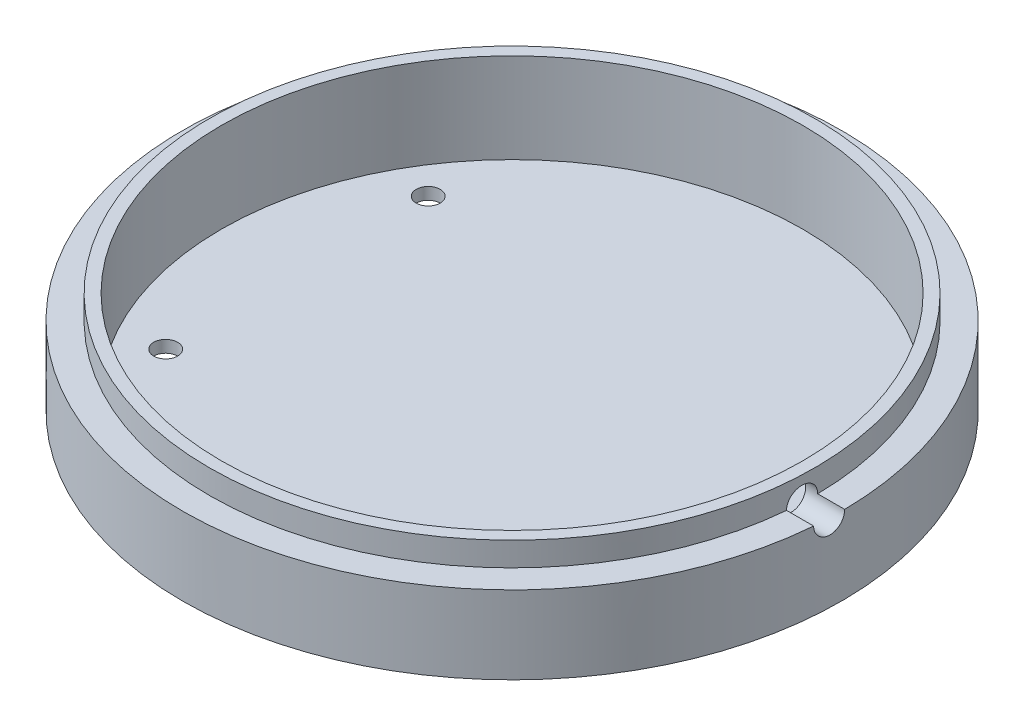
ISO-10303-21;
HEADER;
FILE_DESCRIPTION(('STEP AP214'),'2;1');
FILE_NAME('part.step','',(''),(''),'','','');
FILE_SCHEMA(('AUTOMOTIVE_DESIGN { 1 0 10303 214 1 1 1 1 }'));
ENDSEC;
DATA;
#1=APPLICATION_CONTEXT('core data for automotive mechanical design processes');
#2=APPLICATION_PROTOCOL_DEFINITION('international standard','automotive_design',2000,#1);
#3=PRODUCT_CONTEXT('',#1,'mechanical');
#4=PRODUCT('Part','Part','',(#3));
#5=PRODUCT_RELATED_PRODUCT_CATEGORY('part','',(#4));
#6=PRODUCT_DEFINITION_FORMATION('','',#4);
#7=PRODUCT_DEFINITION_CONTEXT('part definition',#1,'design');
#8=PRODUCT_DEFINITION('design','',#6,#7);
#9=PRODUCT_DEFINITION_SHAPE('','',#8);
#10=(LENGTH_UNIT() NAMED_UNIT(*) SI_UNIT(.MILLI.,.METRE.));
#11=(NAMED_UNIT(*) PLANE_ANGLE_UNIT() SI_UNIT($,.RADIAN.));
#12=(NAMED_UNIT(*) SI_UNIT($,.STERADIAN.) SOLID_ANGLE_UNIT());
#13=UNCERTAINTY_MEASURE_WITH_UNIT(LENGTH_MEASURE(1.E-05),#10,'distance_accuracy_value','');
#14=(GEOMETRIC_REPRESENTATION_CONTEXT(3) GLOBAL_UNCERTAINTY_ASSIGNED_CONTEXT((#13)) GLOBAL_UNIT_ASSIGNED_CONTEXT((#10,
#11,#12)) REPRESENTATION_CONTEXT('',''));
#15=CARTESIAN_POINT('',(0.,0.,0.));
#16=DIRECTION('',(0.,0.,1.));
#17=DIRECTION('',(1.,0.,0.));
#18=AXIS2_PLACEMENT_3D('',#15,#16,#17);
#19=CARTESIAN_POINT('',(0.,13.,0.));
#20=DIRECTION('',(0.,-1.,0.));
#21=DIRECTION('',(0.,0.,-1.));
#22=AXIS2_PLACEMENT_3D('',#19,#20,#21);
#23=CYLINDRICAL_SURFACE('',#22,55.);
#24=CARTESIAN_POINT('',(0.,0.,0.));
#25=DIRECTION('',(0.,1.,0.));
#26=DIRECTION('',(0.,0.,1.));
#27=AXIS2_PLACEMENT_3D('',#24,#25,#26);
#28=CIRCLE('',#27,55.);
#29=CARTESIAN_POINT('',(0.,0.,55.));
#30=VERTEX_POINT('',#29);
#31=EDGE_CURVE('E192',#30,#30,#28,.T.);
#32=ORIENTED_EDGE('',*,*,#31,.T.);
#33=EDGE_LOOP('',(#32));
#34=FACE_BOUND('',#33,.T.);
#35=CARTESIAN_POINT('',(54.8155999693518,13.,4.5));
#36=CARTESIAN_POINT('',(54.8155983995871,12.9298297064675,4.50000686898044));
#37=CARTESIAN_POINT('',(54.8158424708288,12.8596627290745,4.49704571114808));
#38=CARTESIAN_POINT('',(54.8168102127968,12.7198326668636,4.48524049891385));
#39=CARTESIAN_POINT('',(54.817533855794,12.6501695531472,4.4763967846463));
#40=CARTESIAN_POINT('',(54.8194482712985,12.511893308751,4.45288930525375));
#41=CARTESIAN_POINT('',(54.8206386579611,12.4432793593086,4.43823034732211));
#42=CARTESIAN_POINT('',(54.8234623014956,12.3075513393883,4.40321324488677));
#43=CARTESIAN_POINT('',(54.8250955538865,12.2404372537414,4.38285515805018));
#44=CARTESIAN_POINT('',(54.8306186752923,12.0420000555667,4.31340330285218));
#45=CARTESIAN_POINT('',(54.8351328519614,11.9135165507092,4.25592074868602));
#46=CARTESIAN_POINT('',(54.8454876976989,11.6681199865616,4.12032400604888));
#47=CARTESIAN_POINT('',(54.8513281602884,11.5512051303029,4.04221302874706));
#48=CARTESIAN_POINT('',(54.8639319033103,11.331895926801,3.86738298659584));
#49=CARTESIAN_POINT('',(54.8706969246008,11.2295297333087,3.77062867374373));
#50=CARTESIAN_POINT('',(54.8846778692196,11.0424664608524,3.56133585574425));
#51=CARTESIAN_POINT('',(54.8918938646935,10.9577722184538,3.4487948214746));
#52=CARTESIAN_POINT('',(54.9063282778711,10.8082614167667,3.21081585107867));
#53=CARTESIAN_POINT('',(54.9135466584752,10.7434938934282,3.08534709817857));
#54=CARTESIAN_POINT('',(54.927539858995,10.6359607438593,2.82529691658091));
#55=CARTESIAN_POINT('',(54.9343147061477,10.5931937654913,2.69071604848275));
#56=CARTESIAN_POINT('',(54.9470719937661,10.5308776725196,2.41622598188404));
#57=CARTESIAN_POINT('',(54.9530543300848,10.5113316067874,2.27631608617846));
#58=CARTESIAN_POINT('',(54.9639803254768,10.4960436611623,1.99515819421601));
#59=CARTESIAN_POINT('',(54.9689239704275,10.5003021049075,1.85391017979258));
#60=CARTESIAN_POINT('',(54.9776408652268,10.5324955513434,1.57433731308931));
#61=CARTESIAN_POINT('',(54.981416024597,10.5603916438506,1.43600803954293));
#62=CARTESIAN_POINT('',(54.9878054829992,10.6390301187327,1.16597601403474));
#63=CARTESIAN_POINT('',(54.9904197940988,10.6897722636034,1.03427319320114));
#64=CARTESIAN_POINT('',(54.9945942782886,10.8125918179653,0.781402844326326));
#65=CARTESIAN_POINT('',(54.9961557220252,10.8846433586514,0.660222771480109));
#66=CARTESIAN_POINT('',(54.9984249148587,11.0480584929222,0.431670323347613));
#67=CARTESIAN_POINT('',(54.9991327047969,11.1394211623602,0.324297287711839));
#68=CARTESIAN_POINT('',(54.9999439314467,11.338855132503,0.126412340330451));
#69=CARTESIAN_POINT('',(55.0000474330046,11.4469246391163,0.0358986204176465));
#70=CARTESIAN_POINT('',(54.9999158777237,11.6767601403725,-0.125741007440721));
#71=CARTESIAN_POINT('',(54.9996807141877,11.7985304403338,-0.196860796893223));
#72=CARTESIAN_POINT('',(54.9991156728593,12.0523860507389,-0.317720039174873));
#73=CARTESIAN_POINT('',(54.9987856957761,12.1844820683789,-0.367436941367662));
#74=CARTESIAN_POINT('',(54.9982220247451,12.4550443456375,-0.443915443368607));
#75=CARTESIAN_POINT('',(54.9979881857985,12.5935006591629,-0.470711679356618));
#76=CARTESIAN_POINT('',(54.997813076319,12.7774087930417,-0.490473167770539));
#77=CARTESIAN_POINT('',(54.9977810379513,12.8218913510113,-0.494047607667849));
#78=CARTESIAN_POINT('',(54.9977381353444,12.9109098931291,-0.498807772845912));
#79=CARTESIAN_POINT('',(54.997727235937,12.9554456649861,-0.499997465672938));
#80=CARTESIAN_POINT('',(54.9977272257682,13.,-0.500000000000002));
#81=B_SPLINE_CURVE_WITH_KNOTS('',3,(#35,#36,#37,#38,#39,#40,#41,#42,#43,#44,#45,#46,#47,#48,#49,
#50,#51,#52,#53,#54,#55,#56,#57,#58,#59,#60,#61,#62,#63,#64,#65,#66,#67,#68,#69,#70,#71,#72,#73,
#74,#75,#76,#77,#78,#79,#80),.UNSPECIFIED.,.F.,.F.,(4,2,2,2,2,2,2,2,2,2,2,2,2,2,2,2,2,2,2,2,2,2,
4),(0.,0.210442048238931,0.420871929600584,0.631128219576992,0.841382382134809,1.26169399365941,
1.68194021497366,2.10298891175693,2.52410514013121,2.94624951819372,3.36836794846858,
3.79054179614422,4.21272138356788,4.63420736376111,5.05568896235081,5.47666098376657,
5.89761286384909,6.31851957067453,6.73955891400426,7.16104079595895,7.58188463173058,
7.71571748361011,7.84932748996267),.UNSPECIFIED.);
#82=CARTESIAN_POINT('',(54.8155999693518,13.,4.5));
#83=VERTEX_POINT('',#82);
#84=CARTESIAN_POINT('',(54.9977272257682,13.,-0.500000000000002));
#85=VERTEX_POINT('',#84);
#86=EDGE_CURVE('E152',#83,#85,#81,.T.);
#87=ORIENTED_EDGE('',*,*,#86,.F.);
#88=CARTESIAN_POINT('',(0.,13.,0.));
#89=DIRECTION('',(0.,1.,0.));
#90=DIRECTION('',(0.,0.,1.));
#91=AXIS2_PLACEMENT_3D('',#88,#89,#90);
#92=CIRCLE('',#91,55.);
#93=EDGE_CURVE('E197',#85,#83,#92,.T.);
#94=ORIENTED_EDGE('',*,*,#93,.F.);
#95=EDGE_LOOP('',(#87,#94));
#96=FACE_BOUND('',#95,.T.);
#97=ADVANCED_FACE('F37',(#34,#96),#23,.T.);
#98=CARTESIAN_POINT('',(0.,13.,0.));
#99=DIRECTION('',(0.,1.,0.));
#100=DIRECTION('',(0.,0.,1.));
#101=AXIS2_PLACEMENT_3D('',#98,#99,#100);
#102=PLANE('',#101);
#103=CARTESIAN_POINT('',(0.,13.,0.));
#104=DIRECTION('',(0.,1.,0.));
#105=DIRECTION('',(0.,0.,1.));
#106=AXIS2_PLACEMENT_3D('',#103,#104,#105);
#107=CIRCLE('',#106,50.5);
#108=CARTESIAN_POINT('',(50.4975246918104,13.,-0.500000000000002));
#109=VERTEX_POINT('',#108);
#110=CARTESIAN_POINT('',(50.2991053598372,13.,4.5));
#111=VERTEX_POINT('',#110);
#112=EDGE_CURVE('E193',#109,#111,#107,.T.);
#113=ORIENTED_EDGE('',*,*,#112,.F.);
#114=DIRECTION('',(-1.,0.,0.));
#115=VECTOR('',#114,1.);
#116=CARTESIAN_POINT('',(56.,13.,-0.500000000000002));
#117=LINE('',#116,#115);
#118=EDGE_CURVE('E159',#109,#85,#117,.F.);
#119=ORIENTED_EDGE('',*,*,#118,.T.);
#120=ORIENTED_EDGE('',*,*,#93,.T.);
#121=DIRECTION('',(-1.,0.,0.));
#122=VECTOR('',#121,1.);
#123=CARTESIAN_POINT('',(56.,13.,4.5));
#124=LINE('',#123,#122);
#125=EDGE_CURVE('E126',#83,#111,#124,.T.);
#126=ORIENTED_EDGE('',*,*,#125,.T.);
#127=EDGE_LOOP('',(#113,#119,#120,#126));
#128=FACE_BOUND('',#127,.T.);
#129=ADVANCED_FACE('F227',(#128),#102,.T.);
#130=CARTESIAN_POINT('',(0.,17.,0.));
#131=DIRECTION('',(0.,-1.,0.));
#132=DIRECTION('',(0.,0.,-1.));
#133=AXIS2_PLACEMENT_3D('',#130,#131,#132);
#134=CYLINDRICAL_SURFACE('',#133,50.5);
#135=CARTESIAN_POINT('',(0.,17.,0.));
#136=DIRECTION('',(0.,1.,0.));
#137=DIRECTION('',(0.,0.,1.));
#138=AXIS2_PLACEMENT_3D('',#135,#136,#137);
#139=CIRCLE('',#138,50.5);
#140=CARTESIAN_POINT('',(0.,17.,50.5));
#141=VERTEX_POINT('',#140);
#142=EDGE_CURVE('E187',#141,#141,#139,.T.);
#143=ORIENTED_EDGE('',*,*,#142,.F.);
#144=EDGE_LOOP('',(#143));
#145=FACE_BOUND('',#144,.T.);
#146=CARTESIAN_POINT('',(50.4975246918104,13.,-0.500000000000002));
#147=CARTESIAN_POINT('',(50.4975235310463,13.0703141617699,-0.500006737916495));
#148=CARTESIAN_POINT('',(50.4975540352248,13.1406251209342,-0.497033575310143));
#149=CARTESIAN_POINT('',(50.4976698978328,13.2807439427119,-0.485179598875231));
#150=CARTESIAN_POINT('',(50.4977552536124,13.3505518294646,-0.476299070440282));
#151=CARTESIAN_POINT('',(50.4979722690332,13.4891259949242,-0.452690801115224));
#152=CARTESIAN_POINT('',(50.498103896092,13.5578929711504,-0.437967173767282));
#153=CARTESIAN_POINT('',(50.4983966558226,13.6939253088943,-0.402792166829666));
#154=CARTESIAN_POINT('',(50.4985577881394,13.761190688474,-0.382340856175736));
#155=CARTESIAN_POINT('',(50.4990544981741,13.9600831154657,-0.312561401881597));
#156=CARTESIAN_POINT('',(50.4994035129552,14.0888653097096,-0.254797654838552));
#157=CARTESIAN_POINT('',(50.4999065962343,14.3348074035332,-0.118508939536619));
#158=CARTESIAN_POINT('',(50.5000607027914,14.4519695680081,-0.0399880280991187));
#159=CARTESIAN_POINT('',(50.4998940270044,14.6714698436737,0.13561532029478));
#160=CARTESIAN_POINT('',(50.4995732426742,14.7738078928668,0.232697834875917));
#161=CARTESIAN_POINT('',(50.4981686666377,14.9607413301456,0.44267555411543));
#162=CARTESIAN_POINT('',(50.4970847619767,15.0453340892258,0.555573097680334));
#163=CARTESIAN_POINT('',(50.4938995690931,15.1943262001763,0.79390230590476));
#164=CARTESIAN_POINT('',(50.4917987573651,15.2587349864386,0.919328078356843));
#165=CARTESIAN_POINT('',(50.4863982636354,15.3655833016323,1.17917767483354));
#166=CARTESIAN_POINT('',(50.4830986637118,15.4080243341598,1.3136008823119));
#167=CARTESIAN_POINT('',(50.4752253125479,15.4697400062555,1.58757472676412));
#168=CARTESIAN_POINT('',(50.4706520362157,15.4890232663151,1.72712343581916));
#169=CARTESIAN_POINT('',(50.4602801151441,15.5039258991904,2.00743611753879));
#170=CARTESIAN_POINT('',(50.4544814370701,15.4995446281806,2.14820012316314));
#171=CARTESIAN_POINT('',(50.441835865312,15.4672508165578,2.42707635379939));
#172=CARTESIAN_POINT('',(50.434988074918,15.4393180528718,2.56518619547225));
#173=CARTESIAN_POINT('',(50.420556551376,15.3607057623341,2.83473214981485));
#174=CARTESIAN_POINT('',(50.4129728102832,15.3100259899043,2.96616819041677));
#175=CARTESIAN_POINT('',(50.3974659028099,15.1872335658996,3.21893056513912));
#176=CARTESIAN_POINT('',(50.3895420688211,15.1150769380903,3.34023549564468));
#177=CARTESIAN_POINT('',(50.3738560602053,14.9514108055068,3.56900451357347));
#178=CARTESIAN_POINT('',(50.3660938792407,14.8599020610108,3.6764691444678));
#179=CARTESIAN_POINT('',(50.3512397799751,14.6600243436771,3.87460366824136));
#180=CARTESIAN_POINT('',(50.3441484117502,14.5516417234245,3.96525983542569));
#181=CARTESIAN_POINT('',(50.33113958478,14.3210818704748,4.12710612463342));
#182=CARTESIAN_POINT('',(50.3252224857801,14.1989004283475,4.1982902837944));
#183=CARTESIAN_POINT('',(50.3150055301361,13.9444485190086,4.3190159141041));
#184=CARTESIAN_POINT('',(50.3107034297673,13.8121923584533,4.36858742737552));
#185=CARTESIAN_POINT('',(50.3040336815916,13.5412899184967,4.44473636019518));
#186=CARTESIAN_POINT('',(50.3016630293529,13.4026539194659,4.47134949607089));
#187=CARTESIAN_POINT('',(50.2999313614506,13.2192399442779,4.49075841006472));
#188=CARTESIAN_POINT('',(50.2996216318764,13.1754258928969,4.4942257820374));
#189=CARTESIAN_POINT('',(50.2992089106256,13.0877471877113,4.4988434098493));
#190=CARTESIAN_POINT('',(50.2991055792735,13.0438827361166,4.49999747277676));
#191=CARTESIAN_POINT('',(50.2991053598372,13.,4.5));
#192=B_SPLINE_CURVE_WITH_KNOTS('',3,(#146,#147,#148,#149,#150,#151,#152,#153,#154,#155,#156,
#157,#158,#159,#160,#161,#162,#163,#164,#165,#166,#167,#168,#169,#170,#171,#172,#173,#174,#175,
#176,#177,#178,#179,#180,#181,#182,#183,#184,#185,#186,#187,#188,#189,#190,#191),.UNSPECIFIED.,
.F.,.F.,(4,2,2,2,2,2,2,2,2,2,2,2,2,2,2,2,2,2,2,2,2,2,4),(0.,0.210873867449235,0.421737548008736,
0.632453043112771,0.843166002251652,1.26441502990909,1.68558178861128,2.10675030867397,
2.52798118182069,2.94901486854717,3.37001973355857,3.79086783069123,4.21172737762311,
4.63294867450751,5.0541745190324,5.47626887408816,5.89834664958425,6.3207675877957,
6.74331773842852,7.16527864640096,7.5865819202111,7.71839538623767,7.84999174384732),.UNSPECIFIED.);
#193=EDGE_CURVE('E118',#109,#111,#192,.T.);
#194=ORIENTED_EDGE('',*,*,#193,.F.);
#195=ORIENTED_EDGE('',*,*,#112,.T.);
#196=EDGE_LOOP('',(#194,#195));
#197=FACE_BOUND('',#196,.T.);
#198=ADVANCED_FACE('F128',(#145,#197),#134,.T.);
#199=CARTESIAN_POINT('',(0.,2.,0.));
#200=DIRECTION('',(0.,1.,0.));
#201=DIRECTION('',(0.,0.,1.));
#202=AXIS2_PLACEMENT_3D('',#199,#200,#201);
#203=CYLINDRICAL_SURFACE('',#202,48.5);
#204=CARTESIAN_POINT('',(0.,2.,0.));
#205=DIRECTION('',(0.,1.,0.));
#206=DIRECTION('',(0.,0.,1.));
#207=AXIS2_PLACEMENT_3D('',#204,#205,#206);
#208=CIRCLE('',#207,48.5);
#209=CARTESIAN_POINT('',(0.,2.,48.5));
#210=VERTEX_POINT('',#209);
#211=EDGE_CURVE('E184',#210,#210,#208,.T.);
#212=ORIENTED_EDGE('',*,*,#211,.F.);
#213=EDGE_LOOP('',(#212));
#214=FACE_BOUND('',#213,.T.);
#215=CARTESIAN_POINT('',(0.,17.,0.));
#216=DIRECTION('',(0.,1.,0.));
#217=DIRECTION('',(0.,0.,1.));
#218=AXIS2_PLACEMENT_3D('',#215,#216,#217);
#219=CIRCLE('',#218,48.5);
#220=CARTESIAN_POINT('',(0.,17.,48.5));
#221=VERTEX_POINT('',#220);
#222=EDGE_CURVE('E183',#221,#221,#219,.T.);
#223=ORIENTED_EDGE('',*,*,#222,.T.);
#224=EDGE_LOOP('',(#223));
#225=FACE_BOUND('',#224,.T.);
#226=CARTESIAN_POINT('',(48.2907858705985,13.,4.5));
#227=CARTESIAN_POINT('',(48.2907869983494,13.1400458171869,4.49999376397492));
#228=CARTESIAN_POINT('',(48.2918907021441,13.2801910099482,4.48819215089214));
#229=CARTESIAN_POINT('',(48.2962265607347,13.5566077401989,4.4412873276228));
#230=CARTESIAN_POINT('',(48.299461222655,13.6928745173943,4.40615666985574));
#231=CARTESIAN_POINT('',(48.30781305381,13.9574830838289,4.31362296534251));
#232=CARTESIAN_POINT('',(48.3129291088612,14.0858295111654,4.25623309966852));
#233=CARTESIAN_POINT('',(48.3246649170977,14.3310271215299,4.12084400911396));
#234=CARTESIAN_POINT('',(48.3312843306607,14.4478808923225,4.04284943837562));
#235=CARTESIAN_POINT('',(48.3455727644471,14.6671466057018,3.86823785388425));
#236=CARTESIAN_POINT('',(48.3532444122863,14.769521048206,3.77157396480461));
#237=CARTESIAN_POINT('',(48.3690986986214,14.9566145053684,3.56247969951368));
#238=CARTESIAN_POINT('',(48.3772813654191,15.0413325410319,3.45004844962752));
#239=CARTESIAN_POINT('',(48.3936565181206,15.1909744777779,3.21220200678276));
#240=CARTESIAN_POINT('',(48.4018489525332,15.2558345914832,3.08674667068886));
#241=CARTESIAN_POINT('',(48.4177319582093,15.3635543242681,2.82669160765621));
#242=CARTESIAN_POINT('',(48.4254225292327,15.4064139328293,2.69209187634552));
#243=CARTESIAN_POINT('',(48.4399051936473,15.4689043706511,2.417534835683));
#244=CARTESIAN_POINT('',(48.4466971541605,15.4885317679564,2.27757673792359));
#245=CARTESIAN_POINT('',(48.4591022764614,15.5039616585219,1.99630167778583));
#246=CARTESIAN_POINT('',(48.4647154547101,15.4997644845005,1.85498473441174));
#247=CARTESIAN_POINT('',(48.4746109420872,15.4676743516801,1.5753210531184));
#248=CARTESIAN_POINT('',(48.4788960209758,15.4398311669001,1.43696870154054));
#249=CARTESIAN_POINT('',(48.4861492064929,15.3612883557515,1.16687538695754));
#250=CARTESIAN_POINT('',(48.4891173235441,15.3105889102779,1.03513437163639));
#251=CARTESIAN_POINT('',(48.4938564158521,15.1878654257406,0.782227629154967));
#252=CARTESIAN_POINT('',(48.495629286958,15.115875419098,0.661045421218322));
#253=CARTESIAN_POINT('',(48.498206741385,14.9525810694077,0.432468418288963));
#254=CARTESIAN_POINT('',(48.499011324808,14.8612767283949,0.32507362184364));
#255=CARTESIAN_POINT('',(48.4999346579205,14.6619410320731,0.12711908176177));
#256=CARTESIAN_POINT('',(48.5000533864411,14.5539091605753,0.0365598578379977));
#257=CARTESIAN_POINT('',(48.499906157839,14.3241840867754,-0.125151211783195));
#258=CARTESIAN_POINT('',(48.4996401995591,14.2024908433771,-0.196302999096772));
#259=CARTESIAN_POINT('',(48.4990004965028,13.948819025278,-0.317217340452529));
#260=CARTESIAN_POINT('',(48.4986266894845,13.8168345434546,-0.36696750170044));
#261=CARTESIAN_POINT('',(48.4979864937392,13.5463870187929,-0.443606993328551));
#262=CARTESIAN_POINT('',(48.4977201050525,13.4079239735362,-0.470496315174723));
#263=CARTESIAN_POINT('',(48.4974182723465,13.1284282204978,-0.500653081529819));
#264=CARTESIAN_POINT('',(48.4973828618745,12.9873951424285,-0.503917094716511));
#265=CARTESIAN_POINT('',(48.4975584254694,12.7067828935153,-0.486721434199493));
#266=CARTESIAN_POINT('',(48.4977693996442,12.567203723308,-0.466261750110578));
#267=CARTESIAN_POINT('',(48.4983427516081,12.2934673149327,-0.402200996684137));
#268=CARTESIAN_POINT('',(48.4987051232031,12.1593098551962,-0.358600874056131));
#269=CARTESIAN_POINT('',(48.4993887585098,11.900218142056,-0.249497259290456));
#270=CARTESIAN_POINT('',(48.4997100221737,11.7752838993615,-0.183993741721003));
#271=CARTESIAN_POINT('',(48.5000474021985,11.5381788853034,-0.0329385307565904));
#272=CARTESIAN_POINT('',(48.5000635036592,11.4260087374432,0.0526141413801727));
#273=CARTESIAN_POINT('',(48.4994910988645,11.2176245498922,0.241336413439971));
#274=CARTESIAN_POINT('',(48.4989025938076,11.1214104785715,0.344505978440134));
#275=CARTESIAN_POINT('',(48.4968287410508,10.9476978141345,0.565495577012816));
#276=CARTESIAN_POINT('',(48.4953436597369,10.8701936715919,0.683311250755987));
#277=CARTESIAN_POINT('',(48.4912346809443,10.7360639585669,0.93026297259272));
#278=CARTESIAN_POINT('',(48.4886107914092,10.679438242453,1.05939894171694));
#279=CARTESIAN_POINT('',(48.4820730240634,10.5886917872186,1.32523528226841));
#280=CARTESIAN_POINT('',(48.4781598905006,10.5545580980456,1.46193125170266));
#281=CARTESIAN_POINT('',(48.4690092607255,10.5096950340537,1.73906758683945));
#282=CARTESIAN_POINT('',(48.4637717613087,10.498965715867,1.87950796160161));
#283=CARTESIAN_POINT('',(48.4520717499067,10.5011919939973,2.16020446790712));
#284=CARTESIAN_POINT('',(48.4456087518019,10.5141570068547,2.3004605040222));
#285=CARTESIAN_POINT('',(48.4316983596991,10.5633976107184,2.57676891696635));
#286=CARTESIAN_POINT('',(48.4242509511942,10.5996735452789,2.71282123181034));
#287=CARTESIAN_POINT('',(48.4087193758759,10.694588252759,2.97715748209569));
#288=CARTESIAN_POINT('',(48.4006339657292,10.753271591844,3.1054253419594));
#289=CARTESIAN_POINT('',(48.3843021994849,10.8913281673662,3.35028000325933));
#290=CARTESIAN_POINT('',(48.3760558472265,10.9707009108185,3.46686708293237));
#291=CARTESIAN_POINT('',(48.3599101143469,11.148048116964,3.68525774724829));
#292=CARTESIAN_POINT('',(48.3520113195286,11.2460526076055,3.78703699279143));
#293=CARTESIAN_POINT('',(48.3371102229767,11.4578507391222,3.9727165698393));
#294=CARTESIAN_POINT('',(48.3301081358122,11.5716481454915,4.05661262533356));
#295=CARTESIAN_POINT('',(48.3175076680898,11.81170309031,4.20403864436552));
#296=CARTESIAN_POINT('',(48.3119083742691,11.9379524471318,4.26758186578422));
#297=CARTESIAN_POINT('',(48.3025281377223,12.1992990127922,4.37247933629053));
#298=CARTESIAN_POINT('',(48.2987450062006,12.334385347175,4.41386030179198));
#299=CARTESIAN_POINT('',(48.29428496795,12.5586043713275,4.46232763393178));
#300=CARTESIAN_POINT('',(48.2929767974885,12.646269120631,4.4764364071059));
#301=CARTESIAN_POINT('',(48.2912268928844,12.8226092891764,4.4952745515513));
#302=CARTESIAN_POINT('',(48.2907851561984,12.9112847054506,4.50000395035577));
#303=CARTESIAN_POINT('',(48.2907858705985,13.,4.5));
#304=B_SPLINE_CURVE_WITH_KNOTS('',3,(#226,#227,#228,#229,#230,#231,#232,#233,#234,#235,#236,
#237,#238,#239,#240,#241,#242,#243,#244,#245,#246,#247,#248,#249,#250,#251,#252,#253,#254,#255,
#256,#257,#258,#259,#260,#261,#262,#263,#264,#265,#266,#267,#268,#269,#270,#271,#272,#273,#274,
#275,#276,#277,#278,#279,#280,#281,#282,#283,#284,#285,#286,#287,#288,#289,#290,#291,#292,#293,
#294,#295,#296,#297,#298,#299,#300,#301,#302,#303),.UNSPECIFIED.,.T.,.F.,(4,2,2,2,2,2,2,2,2,2,2,
2,2,2,2,2,2,2,2,2,2,2,2,2,2,2,2,2,2,2,2,2,2,2,2,2,2,2,4),(0.,0.419812985383906,
0.840120775190917,1.26018005347148,1.68014453075716,2.10117750384078,2.5222338157302,
2.94462878283616,3.36702395189101,3.78948151106725,4.21193317048901,4.6334977818766,
5.05505905686491,5.47595008584213,5.89684107047528,6.31774504582275,6.73865028737149,
7.15979893068439,7.5809477312134,8.00215769785337,8.42336784888087,8.84456076890713,
9.26575417797741,9.68696815277783,10.1081812925938,10.5292693452863,10.9503544607408,
11.3711969190864,11.7920403957547,12.213051159333,12.6340681278752,13.0559268573373,
13.4777755357113,13.9003099423644,14.3229452672459,14.7453047239898,15.1671538773262,
15.4330950009672,15.6990353439358),.UNSPECIFIED.);
#305=CARTESIAN_POINT('',(48.2907858705985,13.,4.5));
#306=VERTEX_POINT('',#305);
#307=EDGE_CURVE('E114',#306,#306,#304,.T.);
#308=ORIENTED_EDGE('',*,*,#307,.F.);
#309=EDGE_LOOP('',(#308));
#310=FACE_BOUND('',#309,.T.);
#311=ADVANCED_FACE('F208',(#214,#225,#310),#203,.F.);
#312=CARTESIAN_POINT('',(0.,0.,0.));
#313=DIRECTION('',(0.,1.,0.));
#314=DIRECTION('',(0.,0.,1.));
#315=AXIS2_PLACEMENT_3D('',#312,#313,#314);
#316=PLANE('',#315);
#317=ORIENTED_EDGE('',*,*,#31,.F.);
#318=EDGE_LOOP('',(#317));
#319=FACE_BOUND('',#318,.T.);
#320=CARTESIAN_POINT('',(36.,0.,22.));
#321=DIRECTION('',(0.,1.,0.));
#322=DIRECTION('',(0.,0.,1.));
#323=AXIS2_PLACEMENT_3D('',#320,#321,#322);
#324=CIRCLE('',#323,2.);
#325=CARTESIAN_POINT('',(36.,0.,24.));
#326=VERTEX_POINT('',#325);
#327=EDGE_CURVE('E171',#326,#326,#324,.T.);
#328=ORIENTED_EDGE('',*,*,#327,.T.);
#329=EDGE_LOOP('',(#328));
#330=FACE_BOUND('',#329,.T.);
#331=CARTESIAN_POINT('',(-36.,0.,-22.));
#332=DIRECTION('',(0.,1.,0.));
#333=DIRECTION('',(0.,0.,1.));
#334=AXIS2_PLACEMENT_3D('',#331,#332,#333);
#335=CIRCLE('',#334,2.);
#336=CARTESIAN_POINT('',(-36.,0.,-20.));
#337=VERTEX_POINT('',#336);
#338=EDGE_CURVE('E174',#337,#337,#335,.T.);
#339=ORIENTED_EDGE('',*,*,#338,.T.);
#340=EDGE_LOOP('',(#339));
#341=FACE_BOUND('',#340,.T.);
#342=CARTESIAN_POINT('',(-35.8,0.,22.));
#343=DIRECTION('',(0.,1.,0.));
#344=DIRECTION('',(0.,0.,1.));
#345=AXIS2_PLACEMENT_3D('',#342,#343,#344);
#346=CIRCLE('',#345,2.);
#347=CARTESIAN_POINT('',(-35.8,0.,24.));
#348=VERTEX_POINT('',#347);
#349=EDGE_CURVE('E177',#348,#348,#346,.T.);
#350=ORIENTED_EDGE('',*,*,#349,.T.);
#351=EDGE_LOOP('',(#350));
#352=FACE_BOUND('',#351,.T.);
#353=CARTESIAN_POINT('',(36.,0.,-22.));
#354=DIRECTION('',(0.,1.,0.));
#355=DIRECTION('',(0.,0.,1.));
#356=AXIS2_PLACEMENT_3D('',#353,#354,#355);
#357=CIRCLE('',#356,2.);
#358=CARTESIAN_POINT('',(36.,0.,-20.));
#359=VERTEX_POINT('',#358);
#360=EDGE_CURVE('E180',#359,#359,#357,.T.);
#361=ORIENTED_EDGE('',*,*,#360,.T.);
#362=EDGE_LOOP('',(#361));
#363=FACE_BOUND('',#362,.T.);
#364=ADVANCED_FACE('F204',(#319,#330,#341,#352,#363),#316,.F.);
#365=CARTESIAN_POINT('',(0.,2.,0.));
#366=DIRECTION('',(0.,1.,0.));
#367=DIRECTION('',(0.,0.,1.));
#368=AXIS2_PLACEMENT_3D('',#365,#366,#367);
#369=PLANE('',#368);
#370=DIRECTION('',(0.,0.,-1.));
#371=VECTOR('',#370,1.);
#372=CARTESIAN_POINT('',(40.3308376566258,2.,0.));
#373=LINE('',#372,#371);
#374=CARTESIAN_POINT('',(40.3308376566258,2.,4.07797949128508));
#375=VERTEX_POINT('',#374);
#376=CARTESIAN_POINT('',(40.3308376566258,2.,-3.30155452738268));
#377=VERTEX_POINT('',#376);
#378=EDGE_CURVE('E11',#375,#377,#373,.T.);
#379=ORIENTED_EDGE('',*,*,#378,.F.);
#380=DIRECTION('',(1.,0.,0.));
#381=VECTOR('',#380,1.);
#382=CARTESIAN_POINT('',(0.,2.,4.07797949128508));
#383=LINE('',#382,#381);
#384=CARTESIAN_POINT('',(34.05656444491,2.,4.07797949128508));
#385=VERTEX_POINT('',#384);
#386=EDGE_CURVE('E45',#385,#375,#383,.T.);
#387=ORIENTED_EDGE('',*,*,#386,.F.);
#388=DIRECTION('',(0.,0.,1.));
#389=VECTOR('',#388,1.);
#390=CARTESIAN_POINT('',(34.05656444491,2.,0.));
#391=LINE('',#390,#389);
#392=CARTESIAN_POINT('',(34.05656444491,2.,-3.30155452738268));
#393=VERTEX_POINT('',#392);
#394=EDGE_CURVE('E376',#393,#385,#391,.T.);
#395=ORIENTED_EDGE('',*,*,#394,.F.);
#396=DIRECTION('',(-1.,0.,0.));
#397=VECTOR('',#396,1.);
#398=CARTESIAN_POINT('',(0.,2.,-3.30155452738268));
#399=LINE('',#398,#397);
#400=EDGE_CURVE('E196',#377,#393,#399,.T.);
#401=ORIENTED_EDGE('',*,*,#400,.F.);
#402=EDGE_LOOP('',(#379,#387,#395,#401));
#403=FACE_BOUND('',#402,.T.);
#404=CARTESIAN_POINT('',(36.,2.,-22.));
#405=DIRECTION('',(0.,1.,0.));
#406=DIRECTION('',(0.,0.,1.));
#407=AXIS2_PLACEMENT_3D('',#404,#405,#406);
#408=CIRCLE('',#407,2.);
#409=CARTESIAN_POINT('',(36.,2.,-20.));
#410=VERTEX_POINT('',#409);
#411=EDGE_CURVE('E158',#410,#410,#408,.T.);
#412=ORIENTED_EDGE('',*,*,#411,.F.);
#413=EDGE_LOOP('',(#412));
#414=FACE_BOUND('',#413,.T.);
#415=CARTESIAN_POINT('',(-35.8,2.,22.));
#416=DIRECTION('',(0.,1.,0.));
#417=DIRECTION('',(0.,0.,1.));
#418=AXIS2_PLACEMENT_3D('',#415,#416,#417);
#419=CIRCLE('',#418,2.);
#420=CARTESIAN_POINT('',(-35.8,2.,24.));
#421=VERTEX_POINT('',#420);
#422=EDGE_CURVE('E164',#421,#421,#419,.T.);
#423=ORIENTED_EDGE('',*,*,#422,.F.);
#424=EDGE_LOOP('',(#423));
#425=FACE_BOUND('',#424,.T.);
#426=CARTESIAN_POINT('',(-36.,2.,-22.));
#427=DIRECTION('',(0.,1.,0.));
#428=DIRECTION('',(0.,0.,1.));
#429=AXIS2_PLACEMENT_3D('',#426,#427,#428);
#430=CIRCLE('',#429,2.);
#431=CARTESIAN_POINT('',(-36.,2.,-20.));
#432=VERTEX_POINT('',#431);
#433=EDGE_CURVE('E160',#432,#432,#430,.T.);
#434=ORIENTED_EDGE('',*,*,#433,.F.);
#435=EDGE_LOOP('',(#434));
#436=FACE_BOUND('',#435,.T.);
#437=CARTESIAN_POINT('',(36.,2.,22.));
#438=DIRECTION('',(0.,1.,0.));
#439=DIRECTION('',(0.,0.,1.));
#440=AXIS2_PLACEMENT_3D('',#437,#438,#439);
#441=CIRCLE('',#440,2.);
#442=CARTESIAN_POINT('',(36.,2.,24.));
#443=VERTEX_POINT('',#442);
#444=EDGE_CURVE('E163',#443,#443,#441,.T.);
#445=ORIENTED_EDGE('',*,*,#444,.F.);
#446=EDGE_LOOP('',(#445));
#447=FACE_BOUND('',#446,.T.);
#448=ORIENTED_EDGE('',*,*,#211,.T.);
#449=EDGE_LOOP('',(#448));
#450=FACE_BOUND('',#449,.T.);
#451=ADVANCED_FACE('F207',(#403,#414,#425,#436,#447,#450),#369,.T.);
#452=CARTESIAN_POINT('',(0.,17.,0.));
#453=DIRECTION('',(0.,1.,0.));
#454=DIRECTION('',(0.,0.,1.));
#455=AXIS2_PLACEMENT_3D('',#452,#453,#454);
#456=PLANE('',#455);
#457=ORIENTED_EDGE('',*,*,#222,.F.);
#458=EDGE_LOOP('',(#457));
#459=FACE_BOUND('',#458,.T.);
#460=ORIENTED_EDGE('',*,*,#142,.T.);
#461=EDGE_LOOP('',(#460));
#462=FACE_BOUND('',#461,.T.);
#463=ADVANCED_FACE('F250',(#459,#462),#456,.T.);
#464=CARTESIAN_POINT('',(36.,-13.,22.));
#465=DIRECTION('',(0.,1.,0.));
#466=DIRECTION('',(0.,0.,1.));
#467=AXIS2_PLACEMENT_3D('',#464,#465,#466);
#468=CYLINDRICAL_SURFACE('',#467,2.);
#469=ORIENTED_EDGE('',*,*,#444,.T.);
#470=EDGE_LOOP('',(#469));
#471=FACE_BOUND('',#470,.T.);
#472=ORIENTED_EDGE('',*,*,#327,.F.);
#473=EDGE_LOOP('',(#472));
#474=FACE_BOUND('',#473,.T.);
#475=ADVANCED_FACE('F252',(#471,#474),#468,.F.);
#476=CARTESIAN_POINT('',(-36.,-13.,-22.));
#477=DIRECTION('',(0.,1.,0.));
#478=DIRECTION('',(0.,0.,1.));
#479=AXIS2_PLACEMENT_3D('',#476,#477,#478);
#480=CYLINDRICAL_SURFACE('',#479,2.);
#481=ORIENTED_EDGE('',*,*,#433,.T.);
#482=EDGE_LOOP('',(#481));
#483=FACE_BOUND('',#482,.T.);
#484=ORIENTED_EDGE('',*,*,#338,.F.);
#485=EDGE_LOOP('',(#484));
#486=FACE_BOUND('',#485,.T.);
#487=ADVANCED_FACE('F140',(#483,#486),#480,.F.);
#488=CARTESIAN_POINT('',(-35.8,-13.,22.));
#489=DIRECTION('',(0.,1.,0.));
#490=DIRECTION('',(0.,0.,1.));
#491=AXIS2_PLACEMENT_3D('',#488,#489,#490);
#492=CYLINDRICAL_SURFACE('',#491,2.);
#493=ORIENTED_EDGE('',*,*,#422,.T.);
#494=EDGE_LOOP('',(#493));
#495=FACE_BOUND('',#494,.T.);
#496=ORIENTED_EDGE('',*,*,#349,.F.);
#497=EDGE_LOOP('',(#496));
#498=FACE_BOUND('',#497,.T.);
#499=ADVANCED_FACE('F218',(#495,#498),#492,.F.);
#500=CARTESIAN_POINT('',(36.,-13.,-22.));
#501=DIRECTION('',(0.,1.,0.));
#502=DIRECTION('',(0.,0.,1.));
#503=AXIS2_PLACEMENT_3D('',#500,#501,#502);
#504=CYLINDRICAL_SURFACE('',#503,2.);
#505=ORIENTED_EDGE('',*,*,#411,.T.);
#506=EDGE_LOOP('',(#505));
#507=FACE_BOUND('',#506,.T.);
#508=ORIENTED_EDGE('',*,*,#360,.F.);
#509=EDGE_LOOP('',(#508));
#510=FACE_BOUND('',#509,.T.);
#511=ADVANCED_FACE('F137',(#507,#510),#504,.F.);
#512=CARTESIAN_POINT('',(56.,13.,2.));
#513=DIRECTION('',(-1.,0.,0.));
#514=DIRECTION('',(0.,0.,1.));
#515=AXIS2_PLACEMENT_3D('',#512,#513,#514);
#516=CYLINDRICAL_SURFACE('',#515,2.5);
#517=ORIENTED_EDGE('',*,*,#307,.T.);
#518=EDGE_LOOP('',(#517));
#519=FACE_BOUND('',#518,.T.);
#520=ORIENTED_EDGE('',*,*,#86,.T.);
#521=ORIENTED_EDGE('',*,*,#118,.F.);
#522=ORIENTED_EDGE('',*,*,#193,.T.);
#523=ORIENTED_EDGE('',*,*,#125,.F.);
#524=EDGE_LOOP('',(#520,#521,#522,#523));
#525=FACE_BOUND('',#524,.T.);
#526=ADVANCED_FACE('F132',(#519,#525),#516,.F.);
#527=CARTESIAN_POINT('',(40.3308376566258,0.,4.07797949128508));
#528=DIRECTION('',(1.,0.,0.));
#529=DIRECTION('',(0.,0.,-1.));
#530=AXIS2_PLACEMENT_3D('',#527,#528,#529);
#531=PLANE('',#530);
#532=DIRECTION('',(0.,1.,0.));
#533=VECTOR('',#532,1.);
#534=CARTESIAN_POINT('',(40.3308376566258,0.,4.07797949128508));
#535=LINE('',#534,#533);
#536=CARTESIAN_POINT('',(40.3308376566258,2.01,4.07797949128508));
#537=VERTEX_POINT('',#536);
#538=EDGE_CURVE('E112',#375,#537,#535,.T.);
#539=ORIENTED_EDGE('',*,*,#538,.F.);
#540=ORIENTED_EDGE('',*,*,#378,.T.);
#541=DIRECTION('',(0.,1.,0.));
#542=VECTOR('',#541,1.);
#543=CARTESIAN_POINT('',(40.3308376566258,0.,-3.30155452738268));
#544=LINE('',#543,#542);
#545=CARTESIAN_POINT('',(40.3308376566258,2.01,-3.30155452738268));
#546=VERTEX_POINT('',#545);
#547=EDGE_CURVE('E85',#377,#546,#544,.T.);
#548=ORIENTED_EDGE('',*,*,#547,.T.);
#549=DIRECTION('',(0.,0.,-1.));
#550=VECTOR('',#549,1.);
#551=CARTESIAN_POINT('',(40.3308376566258,2.01,4.07797949128508));
#552=LINE('',#551,#550);
#553=EDGE_CURVE('E90',#537,#546,#552,.T.);
#554=ORIENTED_EDGE('',*,*,#553,.F.);
#555=EDGE_LOOP('',(#539,#540,#548,#554));
#556=FACE_BOUND('',#555,.T.);
#557=ADVANCED_FACE('F88',(#556),#531,.T.);
#558=CARTESIAN_POINT('',(40.3308376566258,0.,4.07797949128508));
#559=DIRECTION('',(0.,0.,1.));
#560=DIRECTION('',(1.,0.,0.));
#561=AXIS2_PLACEMENT_3D('',#558,#559,#560);
#562=PLANE('',#561);
#563=DIRECTION('',(0.,1.,0.));
#564=VECTOR('',#563,1.);
#565=CARTESIAN_POINT('',(34.05656444491,0.,4.07797949128508));
#566=LINE('',#565,#564);
#567=CARTESIAN_POINT('',(34.05656444491,2.01,4.07797949128508));
#568=VERTEX_POINT('',#567);
#569=EDGE_CURVE('E115',#385,#568,#566,.T.);
#570=ORIENTED_EDGE('',*,*,#569,.F.);
#571=ORIENTED_EDGE('',*,*,#386,.T.);
#572=ORIENTED_EDGE('',*,*,#538,.T.);
#573=DIRECTION('',(1.,0.,0.));
#574=VECTOR('',#573,1.);
#575=CARTESIAN_POINT('',(40.3308376566258,2.01,4.07797949128508));
#576=LINE('',#575,#574);
#577=EDGE_CURVE('E94',#568,#537,#576,.T.);
#578=ORIENTED_EDGE('',*,*,#577,.F.);
#579=EDGE_LOOP('',(#570,#571,#572,#578));
#580=FACE_BOUND('',#579,.T.);
#581=ADVANCED_FACE('F339',(#580),#562,.T.);
#582=CARTESIAN_POINT('',(34.05656444491,0.,4.07797949128508));
#583=DIRECTION('',(-1.,0.,0.));
#584=DIRECTION('',(0.,0.,1.));
#585=AXIS2_PLACEMENT_3D('',#582,#583,#584);
#586=PLANE('',#585);
#587=DIRECTION('',(0.,1.,0.));
#588=VECTOR('',#587,1.);
#589=CARTESIAN_POINT('',(34.05656444491,0.,-3.30155452738268));
#590=LINE('',#589,#588);
#591=CARTESIAN_POINT('',(34.05656444491,2.01,-3.30155452738268));
#592=VERTEX_POINT('',#591);
#593=EDGE_CURVE('E93',#393,#592,#590,.T.);
#594=ORIENTED_EDGE('',*,*,#593,.F.);
#595=ORIENTED_EDGE('',*,*,#394,.T.);
#596=ORIENTED_EDGE('',*,*,#569,.T.);
#597=DIRECTION('',(0.,0.,1.));
#598=VECTOR('',#597,1.);
#599=CARTESIAN_POINT('',(34.05656444491,2.01,4.07797949128508));
#600=LINE('',#599,#598);
#601=EDGE_CURVE('E103',#592,#568,#600,.T.);
#602=ORIENTED_EDGE('',*,*,#601,.F.);
#603=EDGE_LOOP('',(#594,#595,#596,#602));
#604=FACE_BOUND('',#603,.T.);
#605=ADVANCED_FACE('F347',(#604),#586,.T.);
#606=CARTESIAN_POINT('',(40.3308376566258,0.,-3.30155452738268));
#607=DIRECTION('',(0.,0.,-1.));
#608=DIRECTION('',(-1.,0.,0.));
#609=AXIS2_PLACEMENT_3D('',#606,#607,#608);
#610=PLANE('',#609);
#611=ORIENTED_EDGE('',*,*,#547,.F.);
#612=ORIENTED_EDGE('',*,*,#400,.T.);
#613=ORIENTED_EDGE('',*,*,#593,.T.);
#614=DIRECTION('',(-1.,0.,0.));
#615=VECTOR('',#614,1.);
#616=CARTESIAN_POINT('',(40.3308376566258,2.01,-3.30155452738268));
#617=LINE('',#616,#615);
#618=EDGE_CURVE('E97',#546,#592,#617,.T.);
#619=ORIENTED_EDGE('',*,*,#618,.F.);
#620=EDGE_LOOP('',(#611,#612,#613,#619));
#621=FACE_BOUND('',#620,.T.);
#622=ADVANCED_FACE('F98',(#621),#610,.T.);
#623=CARTESIAN_POINT('',(0.,2.01,0.));
#624=DIRECTION('',(0.,1.,0.));
#625=DIRECTION('',(0.,0.,1.));
#626=AXIS2_PLACEMENT_3D('',#623,#624,#625);
#627=PLANE('',#626);
#628=ORIENTED_EDGE('',*,*,#553,.T.);
#629=ORIENTED_EDGE('',*,*,#618,.T.);
#630=ORIENTED_EDGE('',*,*,#601,.T.);
#631=ORIENTED_EDGE('',*,*,#577,.T.);
#632=EDGE_LOOP('',(#628,#629,#630,#631));
#633=FACE_BOUND('',#632,.T.);
#634=ADVANCED_FACE('F106',(#633),#627,.T.);
#635=CLOSED_SHELL('',(#97,#129,#198,#311,#364,#451,#463,#475,#487,#499,#511,#526,#557,#581,#605,
#622,#634));
#636=MANIFOLD_SOLID_BREP('B2',#635);
#637=ADVANCED_BREP_SHAPE_REPRESENTATION('',(#18,#636),#14);
#638=SHAPE_DEFINITION_REPRESENTATION(#9,#637);
ENDSEC;
END-ISO-10303-21;
